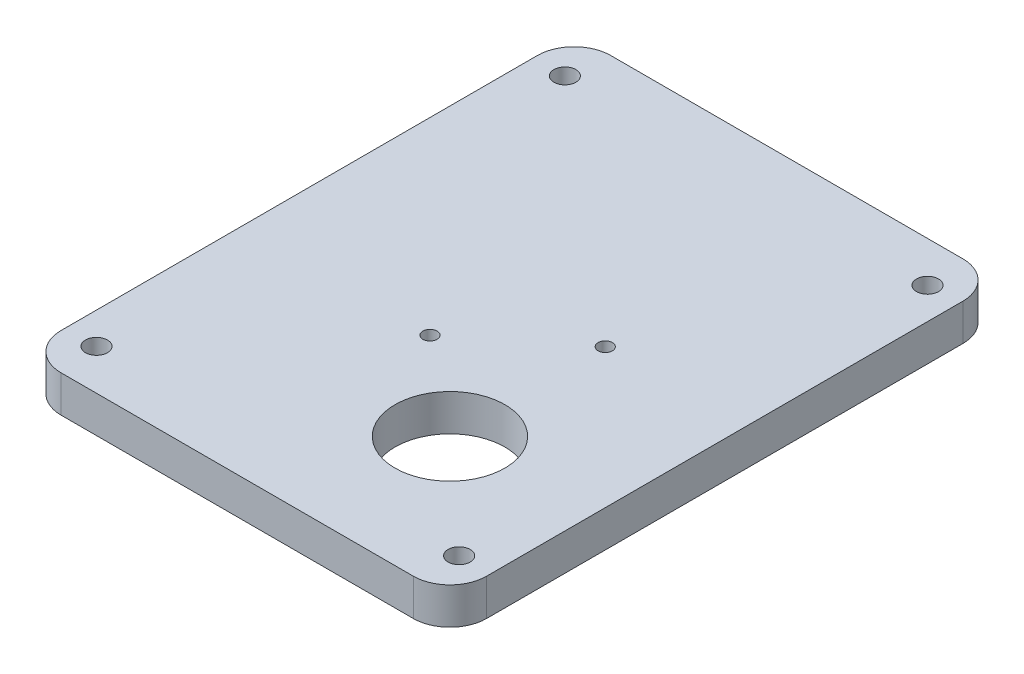
ISO-10303-21;
HEADER;
FILE_DESCRIPTION(('STEP AP214'),'2;1');
FILE_NAME('part.step','',(''),(''),'','','');
FILE_SCHEMA(('AUTOMOTIVE_DESIGN { 1 0 10303 214 1 1 1 1 }'));
ENDSEC;
DATA;
#1=APPLICATION_CONTEXT('core data for automotive mechanical design processes');
#2=APPLICATION_PROTOCOL_DEFINITION('international standard','automotive_design',2000,#1);
#3=PRODUCT_CONTEXT('',#1,'mechanical');
#4=PRODUCT('Part','Part','',(#3));
#5=PRODUCT_RELATED_PRODUCT_CATEGORY('part','',(#4));
#6=PRODUCT_DEFINITION_FORMATION('','',#4);
#7=PRODUCT_DEFINITION_CONTEXT('part definition',#1,'design');
#8=PRODUCT_DEFINITION('design','',#6,#7);
#9=PRODUCT_DEFINITION_SHAPE('','',#8);
#10=(LENGTH_UNIT() NAMED_UNIT(*) SI_UNIT(.MILLI.,.METRE.));
#11=(NAMED_UNIT(*) PLANE_ANGLE_UNIT() SI_UNIT($,.RADIAN.));
#12=(NAMED_UNIT(*) SI_UNIT($,.STERADIAN.) SOLID_ANGLE_UNIT());
#13=UNCERTAINTY_MEASURE_WITH_UNIT(LENGTH_MEASURE(1.E-05),#10,'distance_accuracy_value','');
#14=(GEOMETRIC_REPRESENTATION_CONTEXT(3) GLOBAL_UNCERTAINTY_ASSIGNED_CONTEXT((#13)) GLOBAL_UNIT_ASSIGNED_CONTEXT((#10,
#11,#12)) REPRESENTATION_CONTEXT('',''));
#15=CARTESIAN_POINT('',(0.,0.,0.));
#16=DIRECTION('',(0.,0.,1.));
#17=DIRECTION('',(1.,0.,0.));
#18=AXIS2_PLACEMENT_3D('',#15,#16,#17);
#19=CARTESIAN_POINT('',(0.,5.,0.));
#20=DIRECTION('',(0.,1.,0.));
#21=DIRECTION('',(0.,0.,1.));
#22=AXIS2_PLACEMENT_3D('',#19,#20,#21);
#23=PLANE('',#22);
#24=CARTESIAN_POINT('',(10.,5.,34.9132247305465));
#25=DIRECTION('',(0.,1.,0.));
#26=DIRECTION('',(0.,0.,1.));
#27=AXIS2_PLACEMENT_3D('',#24,#25,#26);
#28=CIRCLE('',#27,7.49);
#29=CARTESIAN_POINT('',(10.,5.,42.4032247305465));
#30=VERTEX_POINT('',#29);
#31=EDGE_CURVE('E258',#30,#30,#28,.T.);
#32=ORIENTED_EDGE('',*,*,#31,.F.);
#33=EDGE_LOOP('',(#32));
#34=FACE_BOUND('',#33,.T.);
#35=CARTESIAN_POINT('',(-24.7146645499354,5.,48.3782540819867));
#36=DIRECTION('',(0.,1.,0.));
#37=DIRECTION('',(0.,0.,1.));
#38=AXIS2_PLACEMENT_3D('',#35,#36,#37);
#39=CIRCLE('',#38,1.50000000000002);
#40=CARTESIAN_POINT('',(-24.7146645499354,5.,46.8782540819867));
#41=VERTEX_POINT('',#40);
#42=EDGE_CURVE('E240',#41,#41,#39,.F.);
#43=ORIENTED_EDGE('',*,*,#42,.T.);
#44=EDGE_LOOP('',(#43));
#45=FACE_BOUND('',#44,.T.);
#46=CARTESIAN_POINT('',(24.7146645499353,5.,-15.4650293514401));
#47=DIRECTION('',(0.,1.,0.));
#48=DIRECTION('',(0.,0.,1.));
#49=AXIS2_PLACEMENT_3D('',#46,#47,#48);
#50=CIRCLE('',#49,1.50000000000003);
#51=CARTESIAN_POINT('',(24.7146645499353,5.,-16.9650293514402));
#52=VERTEX_POINT('',#51);
#53=EDGE_CURVE('E243',#52,#52,#50,.F.);
#54=ORIENTED_EDGE('',*,*,#53,.T.);
#55=EDGE_LOOP('',(#54));
#56=FACE_BOUND('',#55,.T.);
#57=CARTESIAN_POINT('',(-3.30433866649104,5.,24.330475907707));
#58=DIRECTION('',(0.,1.,0.));
#59=DIRECTION('',(0.,0.,1.));
#60=AXIS2_PLACEMENT_3D('',#57,#58,#59);
#61=CIRCLE('',#60,0.975);
#62=CARTESIAN_POINT('',(-3.30433866649104,5.,25.305475907707));
#63=VERTEX_POINT('',#62);
#64=EDGE_CURVE('E140',#63,#63,#61,.T.);
#65=ORIENTED_EDGE('',*,*,#64,.F.);
#66=EDGE_LOOP('',(#65));
#67=FACE_BOUND('',#66,.T.);
#68=CARTESIAN_POINT('',(10.,5.,13.7477270848675));
#69=DIRECTION('',(0.,1.,0.));
#70=DIRECTION('',(0.,0.,1.));
#71=AXIS2_PLACEMENT_3D('',#68,#69,#70);
#72=CIRCLE('',#71,0.975);
#73=CARTESIAN_POINT('',(10.,5.,14.7227270848675));
#74=VERTEX_POINT('',#73);
#75=EDGE_CURVE('E229',#74,#74,#72,.T.);
#76=ORIENTED_EDGE('',*,*,#75,.F.);
#77=EDGE_LOOP('',(#76));
#78=FACE_BOUND('',#77,.T.);
#79=DIRECTION('',(0.,0.,-1.));
#80=VECTOR('',#79,1.);
#81=CARTESIAN_POINT('',(29.,5.,0.));
#82=LINE('',#81,#80);
#83=CARTESIAN_POINT('',(29.,5.,48.9132247305466));
#84=VERTEX_POINT('',#83);
#85=CARTESIAN_POINT('',(29.,5.,-16.));
#86=VERTEX_POINT('',#85);
#87=EDGE_CURVE('E228',#84,#86,#82,.T.);
#88=ORIENTED_EDGE('',*,*,#87,.T.);
#89=CARTESIAN_POINT('',(24.,5.,-16.));
#90=DIRECTION('',(0.,1.,0.));
#91=DIRECTION('',(0.,0.,1.));
#92=AXIS2_PLACEMENT_3D('',#89,#90,#91);
#93=CIRCLE('',#92,5.);
#94=CARTESIAN_POINT('',(24.,5.,-21.));
#95=VERTEX_POINT('',#94);
#96=EDGE_CURVE('E155',#86,#95,#93,.T.);
#97=ORIENTED_EDGE('',*,*,#96,.T.);
#98=DIRECTION('',(-1.,0.,0.));
#99=VECTOR('',#98,1.);
#100=CARTESIAN_POINT('',(0.,5.,-21.));
#101=LINE('',#100,#99);
#102=CARTESIAN_POINT('',(-24.,5.,-21.));
#103=VERTEX_POINT('',#102);
#104=EDGE_CURVE('E122',#95,#103,#101,.T.);
#105=ORIENTED_EDGE('',*,*,#104,.T.);
#106=CARTESIAN_POINT('',(-24.,5.,-16.));
#107=DIRECTION('',(0.,1.,0.));
#108=DIRECTION('',(0.,0.,1.));
#109=AXIS2_PLACEMENT_3D('',#106,#107,#108);
#110=CIRCLE('',#109,5.);
#111=CARTESIAN_POINT('',(-29.,5.,-16.));
#112=VERTEX_POINT('',#111);
#113=EDGE_CURVE('E150',#103,#112,#110,.T.);
#114=ORIENTED_EDGE('',*,*,#113,.T.);
#115=DIRECTION('',(0.,0.,1.));
#116=VECTOR('',#115,1.);
#117=CARTESIAN_POINT('',(-29.,5.,0.));
#118=LINE('',#117,#116);
#119=CARTESIAN_POINT('',(-29.,5.,48.9132247305466));
#120=VERTEX_POINT('',#119);
#121=EDGE_CURVE('E166',#112,#120,#118,.T.);
#122=ORIENTED_EDGE('',*,*,#121,.T.);
#123=CARTESIAN_POINT('',(-24.,5.,48.9132247305466));
#124=DIRECTION('',(0.,1.,0.));
#125=DIRECTION('',(0.,0.,1.));
#126=AXIS2_PLACEMENT_3D('',#123,#124,#125);
#127=CIRCLE('',#126,5.);
#128=CARTESIAN_POINT('',(-24.,5.,53.9132247305466));
#129=VERTEX_POINT('',#128);
#130=EDGE_CURVE('E58',#120,#129,#127,.T.);
#131=ORIENTED_EDGE('',*,*,#130,.T.);
#132=DIRECTION('',(1.,0.,0.));
#133=VECTOR('',#132,1.);
#134=CARTESIAN_POINT('',(0.,5.,53.9132247305466));
#135=LINE('',#134,#133);
#136=CARTESIAN_POINT('',(24.,5.,53.9132247305466));
#137=VERTEX_POINT('',#136);
#138=EDGE_CURVE('E141',#129,#137,#135,.T.);
#139=ORIENTED_EDGE('',*,*,#138,.T.);
#140=CARTESIAN_POINT('',(24.,5.,48.9132247305466));
#141=DIRECTION('',(0.,1.,0.));
#142=DIRECTION('',(0.,0.,1.));
#143=AXIS2_PLACEMENT_3D('',#140,#141,#142);
#144=CIRCLE('',#143,5.);
#145=EDGE_CURVE('E153',#137,#84,#144,.T.);
#146=ORIENTED_EDGE('',*,*,#145,.T.);
#147=EDGE_LOOP('',(#88,#97,#105,#114,#122,#131,#139,#146));
#148=FACE_BOUND('',#147,.T.);
#149=CARTESIAN_POINT('',(24.7146645499353,5.,48.3782540819867));
#150=DIRECTION('',(0.,1.,0.));
#151=DIRECTION('',(0.,0.,1.));
#152=AXIS2_PLACEMENT_3D('',#149,#150,#151);
#153=CIRCLE('',#152,1.50000000000002);
#154=CARTESIAN_POINT('',(24.7146645499353,5.,46.8782540819867));
#155=VERTEX_POINT('',#154);
#156=EDGE_CURVE('E237',#155,#155,#153,.T.);
#157=ORIENTED_EDGE('',*,*,#156,.F.);
#158=EDGE_LOOP('',(#157));
#159=FACE_BOUND('',#158,.T.);
#160=CARTESIAN_POINT('',(-24.7146645499354,5.,-15.4650293514401));
#161=DIRECTION('',(0.,1.,0.));
#162=DIRECTION('',(0.,0.,1.));
#163=AXIS2_PLACEMENT_3D('',#160,#161,#162);
#164=CIRCLE('',#163,1.50000000000002);
#165=CARTESIAN_POINT('',(-24.7146645499354,5.,-16.9650293514402));
#166=VERTEX_POINT('',#165);
#167=EDGE_CURVE('E181',#166,#166,#164,.T.);
#168=ORIENTED_EDGE('',*,*,#167,.F.);
#169=EDGE_LOOP('',(#168));
#170=FACE_BOUND('',#169,.T.);
#171=ADVANCED_FACE('F36',(#34,#45,#56,#67,#78,#148,#159,#170),#23,.T.);
#172=CARTESIAN_POINT('',(0.,0.,0.));
#173=DIRECTION('',(0.,1.,0.));
#174=DIRECTION('',(0.,0.,1.));
#175=AXIS2_PLACEMENT_3D('',#172,#173,#174);
#176=PLANE('',#175);
#177=CARTESIAN_POINT('',(10.,0.,34.9132247305465));
#178=DIRECTION('',(0.,1.,0.));
#179=DIRECTION('',(0.,0.,1.));
#180=AXIS2_PLACEMENT_3D('',#177,#178,#179);
#181=CIRCLE('',#180,7.49);
#182=CARTESIAN_POINT('',(10.,0.,42.4032247305465));
#183=VERTEX_POINT('',#182);
#184=EDGE_CURVE('E261',#183,#183,#181,.T.);
#185=ORIENTED_EDGE('',*,*,#184,.T.);
#186=EDGE_LOOP('',(#185));
#187=FACE_BOUND('',#186,.T.);
#188=CARTESIAN_POINT('',(24.7146645499353,0.,48.3782540819867));
#189=DIRECTION('',(0.,1.,0.));
#190=DIRECTION('',(0.,0.,1.));
#191=AXIS2_PLACEMENT_3D('',#188,#189,#190);
#192=CIRCLE('',#191,1.50000000000002);
#193=CARTESIAN_POINT('',(24.7146645499353,0.,46.8782540819867));
#194=VERTEX_POINT('',#193);
#195=EDGE_CURVE('E250',#194,#194,#192,.F.);
#196=ORIENTED_EDGE('',*,*,#195,.F.);
#197=EDGE_LOOP('',(#196));
#198=FACE_BOUND('',#197,.T.);
#199=CARTESIAN_POINT('',(-24.7146645499354,0.,48.3782540819867));
#200=DIRECTION('',(0.,1.,0.));
#201=DIRECTION('',(0.,0.,1.));
#202=AXIS2_PLACEMENT_3D('',#199,#200,#201);
#203=CIRCLE('',#202,1.50000000000002);
#204=CARTESIAN_POINT('',(-24.7146645499354,0.,46.8782540819867));
#205=VERTEX_POINT('',#204);
#206=EDGE_CURVE('E253',#205,#205,#203,.T.);
#207=ORIENTED_EDGE('',*,*,#206,.T.);
#208=EDGE_LOOP('',(#207));
#209=FACE_BOUND('',#208,.T.);
#210=CARTESIAN_POINT('',(24.7146645499353,0.,-15.4650293514401));
#211=DIRECTION('',(0.,1.,0.));
#212=DIRECTION('',(0.,0.,1.));
#213=AXIS2_PLACEMENT_3D('',#210,#211,#212);
#214=CIRCLE('',#213,1.50000000000003);
#215=CARTESIAN_POINT('',(24.7146645499353,0.,-16.9650293514402));
#216=VERTEX_POINT('',#215);
#217=EDGE_CURVE('E246',#216,#216,#214,.T.);
#218=ORIENTED_EDGE('',*,*,#217,.T.);
#219=EDGE_LOOP('',(#218));
#220=FACE_BOUND('',#219,.T.);
#221=CARTESIAN_POINT('',(-3.30433866649104,0.,24.330475907707));
#222=DIRECTION('',(0.,1.,0.));
#223=DIRECTION('',(0.,0.,1.));
#224=AXIS2_PLACEMENT_3D('',#221,#222,#223);
#225=CIRCLE('',#224,0.975);
#226=CARTESIAN_POINT('',(-3.30433866649104,0.,25.305475907707));
#227=VERTEX_POINT('',#226);
#228=EDGE_CURVE('E179',#227,#227,#225,.T.);
#229=ORIENTED_EDGE('',*,*,#228,.T.);
#230=EDGE_LOOP('',(#229));
#231=FACE_BOUND('',#230,.T.);
#232=CARTESIAN_POINT('',(10.,0.,13.7477270848675));
#233=DIRECTION('',(0.,1.,0.));
#234=DIRECTION('',(0.,0.,1.));
#235=AXIS2_PLACEMENT_3D('',#232,#233,#234);
#236=CIRCLE('',#235,0.975);
#237=CARTESIAN_POINT('',(10.,0.,14.7227270848675));
#238=VERTEX_POINT('',#237);
#239=EDGE_CURVE('E135',#238,#238,#236,.T.);
#240=ORIENTED_EDGE('',*,*,#239,.T.);
#241=EDGE_LOOP('',(#240));
#242=FACE_BOUND('',#241,.T.);
#243=DIRECTION('',(-1.,0.,0.));
#244=VECTOR('',#243,1.);
#245=CARTESIAN_POINT('',(0.,0.,-21.));
#246=LINE('',#245,#244);
#247=CARTESIAN_POINT('',(24.,0.,-21.));
#248=VERTEX_POINT('',#247);
#249=CARTESIAN_POINT('',(-24.,0.,-21.));
#250=VERTEX_POINT('',#249);
#251=EDGE_CURVE('E119',#248,#250,#246,.T.);
#252=ORIENTED_EDGE('',*,*,#251,.F.);
#253=CARTESIAN_POINT('',(24.,0.,-16.));
#254=DIRECTION('',(0.,1.,0.));
#255=DIRECTION('',(0.,0.,1.));
#256=AXIS2_PLACEMENT_3D('',#253,#254,#255);
#257=CIRCLE('',#256,5.);
#258=CARTESIAN_POINT('',(29.,0.,-16.));
#259=VERTEX_POINT('',#258);
#260=EDGE_CURVE('E102',#248,#259,#257,.F.);
#261=ORIENTED_EDGE('',*,*,#260,.T.);
#262=DIRECTION('',(0.,0.,-1.));
#263=VECTOR('',#262,1.);
#264=CARTESIAN_POINT('',(29.,0.,0.));
#265=LINE('',#264,#263);
#266=CARTESIAN_POINT('',(29.,0.,48.9132247305466));
#267=VERTEX_POINT('',#266);
#268=EDGE_CURVE('E130',#267,#259,#265,.T.);
#269=ORIENTED_EDGE('',*,*,#268,.F.);
#270=CARTESIAN_POINT('',(24.,0.,48.9132247305466));
#271=DIRECTION('',(0.,1.,0.));
#272=DIRECTION('',(0.,0.,1.));
#273=AXIS2_PLACEMENT_3D('',#270,#271,#272);
#274=CIRCLE('',#273,5.);
#275=CARTESIAN_POINT('',(24.,0.,53.9132247305466));
#276=VERTEX_POINT('',#275);
#277=EDGE_CURVE('E113',#267,#276,#274,.F.);
#278=ORIENTED_EDGE('',*,*,#277,.T.);
#279=DIRECTION('',(1.,0.,0.));
#280=VECTOR('',#279,1.);
#281=CARTESIAN_POINT('',(0.,0.,53.9132247305466));
#282=LINE('',#281,#280);
#283=CARTESIAN_POINT('',(-24.,0.,53.9132247305466));
#284=VERTEX_POINT('',#283);
#285=EDGE_CURVE('E133',#284,#276,#282,.T.);
#286=ORIENTED_EDGE('',*,*,#285,.F.);
#287=CARTESIAN_POINT('',(-24.,0.,48.9132247305466));
#288=DIRECTION('',(0.,1.,0.));
#289=DIRECTION('',(0.,0.,1.));
#290=AXIS2_PLACEMENT_3D('',#287,#288,#289);
#291=CIRCLE('',#290,5.);
#292=CARTESIAN_POINT('',(-29.,0.,48.9132247305466));
#293=VERTEX_POINT('',#292);
#294=EDGE_CURVE('E144',#284,#293,#291,.F.);
#295=ORIENTED_EDGE('',*,*,#294,.T.);
#296=DIRECTION('',(0.,0.,1.));
#297=VECTOR('',#296,1.);
#298=CARTESIAN_POINT('',(-29.,0.,0.));
#299=LINE('',#298,#297);
#300=CARTESIAN_POINT('',(-29.,0.,-16.));
#301=VERTEX_POINT('',#300);
#302=EDGE_CURVE('E129',#301,#293,#299,.T.);
#303=ORIENTED_EDGE('',*,*,#302,.F.);
#304=CARTESIAN_POINT('',(-24.,0.,-16.));
#305=DIRECTION('',(0.,1.,0.));
#306=DIRECTION('',(0.,0.,1.));
#307=AXIS2_PLACEMENT_3D('',#304,#305,#306);
#308=CIRCLE('',#307,5.);
#309=EDGE_CURVE('E123',#301,#250,#308,.F.);
#310=ORIENTED_EDGE('',*,*,#309,.T.);
#311=EDGE_LOOP('',(#252,#261,#269,#278,#286,#295,#303,#310));
#312=FACE_BOUND('',#311,.T.);
#313=CARTESIAN_POINT('',(-24.7146645499354,0.,-15.4650293514401));
#314=DIRECTION('',(0.,1.,0.));
#315=DIRECTION('',(0.,0.,1.));
#316=AXIS2_PLACEMENT_3D('',#313,#314,#315);
#317=CIRCLE('',#316,1.50000000000002);
#318=CARTESIAN_POINT('',(-24.7146645499354,0.,-16.9650293514402));
#319=VERTEX_POINT('',#318);
#320=EDGE_CURVE('E249',#319,#319,#317,.F.);
#321=ORIENTED_EDGE('',*,*,#320,.F.);
#322=EDGE_LOOP('',(#321));
#323=FACE_BOUND('',#322,.T.);
#324=ADVANCED_FACE('F126',(#187,#198,#209,#220,#231,#242,#312,#323),#176,.F.);
#325=CARTESIAN_POINT('',(29.,5.,0.));
#326=DIRECTION('',(-1.,0.,0.));
#327=DIRECTION('',(0.,0.,1.));
#328=AXIS2_PLACEMENT_3D('',#325,#326,#327);
#329=PLANE('',#328);
#330=ORIENTED_EDGE('',*,*,#268,.T.);
#331=DIRECTION('',(0.,-1.,0.));
#332=VECTOR('',#331,1.);
#333=CARTESIAN_POINT('',(29.,5.,-16.));
#334=LINE('',#333,#332);
#335=EDGE_CURVE('E107',#259,#86,#334,.F.);
#336=ORIENTED_EDGE('',*,*,#335,.T.);
#337=ORIENTED_EDGE('',*,*,#87,.F.);
#338=DIRECTION('',(0.,-1.,0.));
#339=VECTOR('',#338,1.);
#340=CARTESIAN_POINT('',(29.,5.,48.9132247305466));
#341=LINE('',#340,#339);
#342=EDGE_CURVE('E112',#84,#267,#341,.T.);
#343=ORIENTED_EDGE('',*,*,#342,.T.);
#344=EDGE_LOOP('',(#330,#336,#337,#343));
#345=FACE_BOUND('',#344,.T.);
#346=ADVANCED_FACE('F206',(#345),#329,.F.);
#347=CARTESIAN_POINT('',(0.,5.,-21.));
#348=DIRECTION('',(0.,0.,1.));
#349=DIRECTION('',(1.,0.,0.));
#350=AXIS2_PLACEMENT_3D('',#347,#348,#349);
#351=PLANE('',#350);
#352=ORIENTED_EDGE('',*,*,#104,.F.);
#353=DIRECTION('',(0.,-1.,0.));
#354=VECTOR('',#353,1.);
#355=CARTESIAN_POINT('',(24.,5.,-21.));
#356=LINE('',#355,#354);
#357=EDGE_CURVE('E106',#95,#248,#356,.T.);
#358=ORIENTED_EDGE('',*,*,#357,.T.);
#359=ORIENTED_EDGE('',*,*,#251,.T.);
#360=DIRECTION('',(0.,-1.,0.));
#361=VECTOR('',#360,1.);
#362=CARTESIAN_POINT('',(-24.,5.,-21.));
#363=LINE('',#362,#361);
#364=EDGE_CURVE('E124',#250,#103,#363,.F.);
#365=ORIENTED_EDGE('',*,*,#364,.T.);
#366=EDGE_LOOP('',(#352,#358,#359,#365));
#367=FACE_BOUND('',#366,.T.);
#368=ADVANCED_FACE('F118',(#367),#351,.F.);
#369=CARTESIAN_POINT('',(-29.,5.,0.));
#370=DIRECTION('',(1.,0.,0.));
#371=DIRECTION('',(0.,0.,-1.));
#372=AXIS2_PLACEMENT_3D('',#369,#370,#371);
#373=PLANE('',#372);
#374=ORIENTED_EDGE('',*,*,#302,.T.);
#375=DIRECTION('',(0.,-1.,0.));
#376=VECTOR('',#375,1.);
#377=CARTESIAN_POINT('',(-29.,5.,48.9132247305466));
#378=LINE('',#377,#376);
#379=EDGE_CURVE('E11',#293,#120,#378,.F.);
#380=ORIENTED_EDGE('',*,*,#379,.T.);
#381=ORIENTED_EDGE('',*,*,#121,.F.);
#382=DIRECTION('',(0.,-1.,0.));
#383=VECTOR('',#382,1.);
#384=CARTESIAN_POINT('',(-29.,5.,-16.));
#385=LINE('',#384,#383);
#386=EDGE_CURVE('E44',#112,#301,#385,.T.);
#387=ORIENTED_EDGE('',*,*,#386,.T.);
#388=EDGE_LOOP('',(#374,#380,#381,#387));
#389=FACE_BOUND('',#388,.T.);
#390=ADVANCED_FACE('F164',(#389),#373,.F.);
#391=CARTESIAN_POINT('',(10.,5.,13.7477270848675));
#392=DIRECTION('',(0.,-1.,0.));
#393=DIRECTION('',(0.,0.,-1.));
#394=AXIS2_PLACEMENT_3D('',#391,#392,#393);
#395=CYLINDRICAL_SURFACE('',#394,0.975);
#396=ORIENTED_EDGE('',*,*,#75,.T.);
#397=EDGE_LOOP('',(#396));
#398=FACE_BOUND('',#397,.T.);
#399=ORIENTED_EDGE('',*,*,#239,.F.);
#400=EDGE_LOOP('',(#399));
#401=FACE_BOUND('',#400,.T.);
#402=ADVANCED_FACE('F186',(#398,#401),#395,.F.);
#403=CARTESIAN_POINT('',(-3.30433866649104,5.,24.330475907707));
#404=DIRECTION('',(0.,-1.,0.));
#405=DIRECTION('',(0.,0.,-1.));
#406=AXIS2_PLACEMENT_3D('',#403,#404,#405);
#407=CYLINDRICAL_SURFACE('',#406,0.975);
#408=ORIENTED_EDGE('',*,*,#64,.T.);
#409=EDGE_LOOP('',(#408));
#410=FACE_BOUND('',#409,.T.);
#411=ORIENTED_EDGE('',*,*,#228,.F.);
#412=EDGE_LOOP('',(#411));
#413=FACE_BOUND('',#412,.T.);
#414=ADVANCED_FACE('F188',(#410,#413),#407,.F.);
#415=CARTESIAN_POINT('',(0.,5.,53.9132247305466));
#416=DIRECTION('',(0.,0.,-1.));
#417=DIRECTION('',(-1.,0.,0.));
#418=AXIS2_PLACEMENT_3D('',#415,#416,#417);
#419=PLANE('',#418);
#420=ORIENTED_EDGE('',*,*,#285,.T.);
#421=DIRECTION('',(0.,-1.,0.));
#422=VECTOR('',#421,1.);
#423=CARTESIAN_POINT('',(24.,5.,53.9132247305466));
#424=LINE('',#423,#422);
#425=EDGE_CURVE('E51',#276,#137,#424,.F.);
#426=ORIENTED_EDGE('',*,*,#425,.T.);
#427=ORIENTED_EDGE('',*,*,#138,.F.);
#428=DIRECTION('',(0.,-1.,0.));
#429=VECTOR('',#428,1.);
#430=CARTESIAN_POINT('',(-24.,5.,53.9132247305466));
#431=LINE('',#430,#429);
#432=EDGE_CURVE('E157',#129,#284,#431,.T.);
#433=ORIENTED_EDGE('',*,*,#432,.T.);
#434=EDGE_LOOP('',(#420,#426,#427,#433));
#435=FACE_BOUND('',#434,.T.);
#436=ADVANCED_FACE('F173',(#435),#419,.F.);
#437=CARTESIAN_POINT('',(24.,5.,-16.));
#438=DIRECTION('',(0.,-1.,0.));
#439=DIRECTION('',(0.,0.,-1.));
#440=AXIS2_PLACEMENT_3D('',#437,#438,#439);
#441=CYLINDRICAL_SURFACE('',#440,5.);
#442=ORIENTED_EDGE('',*,*,#96,.F.);
#443=ORIENTED_EDGE('',*,*,#335,.F.);
#444=ORIENTED_EDGE('',*,*,#260,.F.);
#445=ORIENTED_EDGE('',*,*,#357,.F.);
#446=EDGE_LOOP('',(#442,#443,#444,#445));
#447=FACE_BOUND('',#446,.T.);
#448=ADVANCED_FACE('F105',(#447),#441,.T.);
#449=CARTESIAN_POINT('',(24.,5.,48.9132247305466));
#450=DIRECTION('',(0.,-1.,0.));
#451=DIRECTION('',(0.,0.,-1.));
#452=AXIS2_PLACEMENT_3D('',#449,#450,#451);
#453=CYLINDRICAL_SURFACE('',#452,5.);
#454=ORIENTED_EDGE('',*,*,#145,.F.);
#455=ORIENTED_EDGE('',*,*,#425,.F.);
#456=ORIENTED_EDGE('',*,*,#277,.F.);
#457=ORIENTED_EDGE('',*,*,#342,.F.);
#458=EDGE_LOOP('',(#454,#455,#456,#457));
#459=FACE_BOUND('',#458,.T.);
#460=ADVANCED_FACE('F226',(#459),#453,.T.);
#461=CARTESIAN_POINT('',(-24.,5.,48.9132247305466));
#462=DIRECTION('',(0.,-1.,0.));
#463=DIRECTION('',(0.,0.,-1.));
#464=AXIS2_PLACEMENT_3D('',#461,#462,#463);
#465=CYLINDRICAL_SURFACE('',#464,5.);
#466=ORIENTED_EDGE('',*,*,#130,.F.);
#467=ORIENTED_EDGE('',*,*,#379,.F.);
#468=ORIENTED_EDGE('',*,*,#294,.F.);
#469=ORIENTED_EDGE('',*,*,#432,.F.);
#470=EDGE_LOOP('',(#466,#467,#468,#469));
#471=FACE_BOUND('',#470,.T.);
#472=ADVANCED_FACE('F172',(#471),#465,.T.);
#473=CARTESIAN_POINT('',(-24.,5.,-16.));
#474=DIRECTION('',(0.,-1.,0.));
#475=DIRECTION('',(0.,0.,-1.));
#476=AXIS2_PLACEMENT_3D('',#473,#474,#475);
#477=CYLINDRICAL_SURFACE('',#476,5.);
#478=ORIENTED_EDGE('',*,*,#113,.F.);
#479=ORIENTED_EDGE('',*,*,#364,.F.);
#480=ORIENTED_EDGE('',*,*,#309,.F.);
#481=ORIENTED_EDGE('',*,*,#386,.F.);
#482=EDGE_LOOP('',(#478,#479,#480,#481));
#483=FACE_BOUND('',#482,.T.);
#484=ADVANCED_FACE('F38',(#483),#477,.T.);
#485=CARTESIAN_POINT('',(24.7146645499353,14.,-15.4650293514401));
#486=DIRECTION('',(0.,-1.,0.));
#487=DIRECTION('',(0.,0.,-1.));
#488=AXIS2_PLACEMENT_3D('',#485,#486,#487);
#489=CYLINDRICAL_SURFACE('',#488,1.50000000000003);
#490=CARTESIAN_POINT('',(24.7146645499353,5.,-16.9650293514402));
#491=CARTESIAN_POINT('',(24.7146645499353,4.94791666666667,-16.9650293514402));
#492=CARTESIAN_POINT('',(24.7146645499353,4.89583333333333,-16.9650293514402));
#493=CARTESIAN_POINT('',(24.7146645499353,4.79166666666667,-16.9650293514402));
#494=CARTESIAN_POINT('',(24.7146645499353,4.73958333333333,-16.9650293514402));
#495=CARTESIAN_POINT('',(24.7146645499353,4.63541666666667,-16.9650293514402));
#496=CARTESIAN_POINT('',(24.7146645499353,4.58333333333333,-16.9650293514402));
#497=CARTESIAN_POINT('',(24.7146645499353,4.47916666666667,-16.9650293514402));
#498=CARTESIAN_POINT('',(24.7146645499353,4.42708333333333,-16.9650293514402));
#499=CARTESIAN_POINT('',(24.7146645499353,4.32291666666667,-16.9650293514402));
#500=CARTESIAN_POINT('',(24.7146645499353,4.27083333333333,-16.9650293514402));
#501=CARTESIAN_POINT('',(24.7146645499353,4.16666666666667,-16.9650293514402));
#502=CARTESIAN_POINT('',(24.7146645499353,4.11458333333333,-16.9650293514402));
#503=CARTESIAN_POINT('',(24.7146645499353,4.01041666666666,-16.9650293514402));
#504=CARTESIAN_POINT('',(24.7146645499353,3.95833333333333,-16.9650293514402));
#505=CARTESIAN_POINT('',(24.7146645499353,3.85416666666667,-16.9650293514402));
#506=CARTESIAN_POINT('',(24.7146645499353,3.80208333333333,-16.9650293514402));
#507=CARTESIAN_POINT('',(24.7146645499353,3.69791666666666,-16.9650293514402));
#508=CARTESIAN_POINT('',(24.7146645499353,3.64583333333333,-16.9650293514402));
#509=CARTESIAN_POINT('',(24.7146645499353,3.54166666666667,-16.9650293514402));
#510=CARTESIAN_POINT('',(24.7146645499353,3.48958333333333,-16.9650293514402));
#511=CARTESIAN_POINT('',(24.7146645499353,3.38541666666667,-16.9650293514402));
#512=CARTESIAN_POINT('',(24.7146645499353,3.33333333333333,-16.9650293514402));
#513=CARTESIAN_POINT('',(24.7146645499353,3.22916666666667,-16.9650293514402));
#514=CARTESIAN_POINT('',(24.7146645499353,3.17708333333333,-16.9650293514402));
#515=CARTESIAN_POINT('',(24.7146645499353,3.07291666666667,-16.9650293514402));
#516=CARTESIAN_POINT('',(24.7146645499353,3.02083333333333,-16.9650293514402));
#517=CARTESIAN_POINT('',(24.7146645499353,2.91666666666667,-16.9650293514402));
#518=CARTESIAN_POINT('',(24.7146645499353,2.86458333333333,-16.9650293514402));
#519=CARTESIAN_POINT('',(24.7146645499353,2.76041666666667,-16.9650293514402));
#520=CARTESIAN_POINT('',(24.7146645499353,2.70833333333333,-16.9650293514402));
#521=CARTESIAN_POINT('',(24.7146645499353,2.60416666666667,-16.9650293514402));
#522=CARTESIAN_POINT('',(24.7146645499353,2.55208333333333,-16.9650293514402));
#523=CARTESIAN_POINT('',(24.7146645499353,2.44791666666667,-16.9650293514402));
#524=CARTESIAN_POINT('',(24.7146645499353,2.39583333333333,-16.9650293514402));
#525=CARTESIAN_POINT('',(24.7146645499353,2.29166666666667,-16.9650293514402));
#526=CARTESIAN_POINT('',(24.7146645499353,2.23958333333333,-16.9650293514402));
#527=CARTESIAN_POINT('',(24.7146645499353,2.13541666666667,-16.9650293514402));
#528=CARTESIAN_POINT('',(24.7146645499353,2.08333333333333,-16.9650293514402));
#529=CARTESIAN_POINT('',(24.7146645499353,1.97916666666667,-16.9650293514402));
#530=CARTESIAN_POINT('',(24.7146645499353,1.92708333333333,-16.9650293514402));
#531=CARTESIAN_POINT('',(24.7146645499353,1.82291666666666,-16.9650293514402));
#532=CARTESIAN_POINT('',(24.7146645499353,1.77083333333333,-16.9650293514402));
#533=CARTESIAN_POINT('',(24.7146645499353,1.66666666666667,-16.9650293514402));
#534=CARTESIAN_POINT('',(24.7146645499353,1.61458333333333,-16.9650293514402));
#535=CARTESIAN_POINT('',(24.7146645499353,1.51041666666667,-16.9650293514402));
#536=CARTESIAN_POINT('',(24.7146645499353,1.45833333333333,-16.9650293514402));
#537=CARTESIAN_POINT('',(24.7146645499353,1.35416666666667,-16.9650293514402));
#538=CARTESIAN_POINT('',(24.7146645499353,1.30208333333333,-16.9650293514402));
#539=CARTESIAN_POINT('',(24.7146645499353,1.19791666666667,-16.9650293514402));
#540=CARTESIAN_POINT('',(24.7146645499353,1.14583333333333,-16.9650293514402));
#541=CARTESIAN_POINT('',(24.7146645499353,1.04166666666667,-16.9650293514402));
#542=CARTESIAN_POINT('',(24.7146645499353,0.989583333333333,-16.9650293514402));
#543=CARTESIAN_POINT('',(24.7146645499353,0.885416666666666,-16.9650293514402));
#544=CARTESIAN_POINT('',(24.7146645499353,0.833333333333332,-16.9650293514402));
#545=CARTESIAN_POINT('',(24.7146645499353,0.729166666666666,-16.9650293514402));
#546=CARTESIAN_POINT('',(24.7146645499353,0.677083333333332,-16.9650293514402));
#547=CARTESIAN_POINT('',(24.7146645499353,0.572916666666666,-16.9650293514402));
#548=CARTESIAN_POINT('',(24.7146645499353,0.520833333333332,-16.9650293514402));
#549=CARTESIAN_POINT('',(24.7146645499353,0.416666666666665,-16.9650293514402));
#550=CARTESIAN_POINT('',(24.7146645499353,0.364583333333332,-16.9650293514402));
#551=CARTESIAN_POINT('',(24.7146645499353,0.260416666666665,-16.9650293514402));
#552=CARTESIAN_POINT('',(24.7146645499353,0.208333333333332,-16.9650293514402));
#553=CARTESIAN_POINT('',(24.7146645499353,0.104166666666665,-16.9650293514402));
#554=CARTESIAN_POINT('',(24.7146645499353,0.0520833333333317,-16.9650293514402));
#555=CARTESIAN_POINT('',(24.7146645499353,0.,-16.9650293514402));
#556=B_SPLINE_CURVE_WITH_KNOTS('',3,(#490,#491,#492,#493,#494,#495,#496,#497,#498,#499,#500,
#501,#502,#503,#504,#505,#506,#507,#508,#509,#510,#511,#512,#513,#514,#515,#516,#517,#518,#519,
#520,#521,#522,#523,#524,#525,#526,#527,#528,#529,#530,#531,#532,#533,#534,#535,#536,#537,#538,
#539,#540,#541,#542,#543,#544,#545,#546,#547,#548,#549,#550,#551,#552,#553,#554,#555),
.UNSPECIFIED.,.F.,.F.,(4,2,2,2,2,2,2,2,2,2,2,2,2,2,2,2,2,2,2,2,2,2,2,2,2,2,2,2,2,2,2,2,4),(0.,
0.15625,0.3125,0.46875,0.625000000000001,0.781250000000001,0.937500000000001,1.09375,1.25,
1.40625,1.5625,1.71875,1.875,2.03125,2.1875,2.34375,2.5,2.65625,2.8125,2.96875,3.125,3.28125,
3.4375,3.59375,3.75,3.90625,4.0625,4.21875,4.375,4.53125,4.6875,4.84375,5.),.UNSPECIFIED.);
#557=EDGE_CURVE('BSEAM212',#52,#216,#556,.T.);
#558=ORIENTED_EDGE('',*,*,#53,.F.);
#559=ORIENTED_EDGE('',*,*,#217,.F.);
#560=ORIENTED_EDGE('',*,*,#557,.T.);
#561=ORIENTED_EDGE('',*,*,#557,.F.);
#562=EDGE_LOOP('',(#558,#560,#559,#561));
#563=FACE_BOUND('',#562,.T.);
#564=ADVANCED_FACE('F212',(#563),#489,.F.);
#565=CARTESIAN_POINT('',(-24.7146645499354,14.,48.3782540819867));
#566=DIRECTION('',(0.,-1.,0.));
#567=DIRECTION('',(0.,0.,-1.));
#568=AXIS2_PLACEMENT_3D('',#565,#566,#567);
#569=CYLINDRICAL_SURFACE('',#568,1.50000000000002);
#570=CARTESIAN_POINT('',(-24.7146645499354,5.,46.8782540819867));
#571=CARTESIAN_POINT('',(-24.7146645499354,4.94791666666667,46.8782540819867));
#572=CARTESIAN_POINT('',(-24.7146645499354,4.89583333333333,46.8782540819867));
#573=CARTESIAN_POINT('',(-24.7146645499354,4.79166666666667,46.8782540819867));
#574=CARTESIAN_POINT('',(-24.7146645499354,4.73958333333333,46.8782540819867));
#575=CARTESIAN_POINT('',(-24.7146645499354,4.63541666666667,46.8782540819867));
#576=CARTESIAN_POINT('',(-24.7146645499354,4.58333333333333,46.8782540819867));
#577=CARTESIAN_POINT('',(-24.7146645499354,4.47916666666667,46.8782540819867));
#578=CARTESIAN_POINT('',(-24.7146645499354,4.42708333333333,46.8782540819867));
#579=CARTESIAN_POINT('',(-24.7146645499354,4.32291666666667,46.8782540819867));
#580=CARTESIAN_POINT('',(-24.7146645499354,4.27083333333333,46.8782540819867));
#581=CARTESIAN_POINT('',(-24.7146645499354,4.16666666666667,46.8782540819867));
#582=CARTESIAN_POINT('',(-24.7146645499354,4.11458333333333,46.8782540819867));
#583=CARTESIAN_POINT('',(-24.7146645499354,4.01041666666666,46.8782540819867));
#584=CARTESIAN_POINT('',(-24.7146645499354,3.95833333333333,46.8782540819867));
#585=CARTESIAN_POINT('',(-24.7146645499354,3.85416666666667,46.8782540819867));
#586=CARTESIAN_POINT('',(-24.7146645499354,3.80208333333333,46.8782540819867));
#587=CARTESIAN_POINT('',(-24.7146645499354,3.69791666666666,46.8782540819867));
#588=CARTESIAN_POINT('',(-24.7146645499354,3.64583333333333,46.8782540819867));
#589=CARTESIAN_POINT('',(-24.7146645499354,3.54166666666667,46.8782540819867));
#590=CARTESIAN_POINT('',(-24.7146645499354,3.48958333333333,46.8782540819867));
#591=CARTESIAN_POINT('',(-24.7146645499354,3.38541666666667,46.8782540819867));
#592=CARTESIAN_POINT('',(-24.7146645499354,3.33333333333333,46.8782540819867));
#593=CARTESIAN_POINT('',(-24.7146645499354,3.22916666666667,46.8782540819867));
#594=CARTESIAN_POINT('',(-24.7146645499354,3.17708333333333,46.8782540819867));
#595=CARTESIAN_POINT('',(-24.7146645499354,3.07291666666667,46.8782540819867));
#596=CARTESIAN_POINT('',(-24.7146645499354,3.02083333333333,46.8782540819867));
#597=CARTESIAN_POINT('',(-24.7146645499354,2.91666666666667,46.8782540819867));
#598=CARTESIAN_POINT('',(-24.7146645499354,2.86458333333333,46.8782540819867));
#599=CARTESIAN_POINT('',(-24.7146645499354,2.76041666666667,46.8782540819867));
#600=CARTESIAN_POINT('',(-24.7146645499354,2.70833333333333,46.8782540819867));
#601=CARTESIAN_POINT('',(-24.7146645499354,2.60416666666667,46.8782540819867));
#602=CARTESIAN_POINT('',(-24.7146645499354,2.55208333333333,46.8782540819867));
#603=CARTESIAN_POINT('',(-24.7146645499354,2.44791666666667,46.8782540819867));
#604=CARTESIAN_POINT('',(-24.7146645499354,2.39583333333333,46.8782540819867));
#605=CARTESIAN_POINT('',(-24.7146645499354,2.29166666666667,46.8782540819867));
#606=CARTESIAN_POINT('',(-24.7146645499354,2.23958333333333,46.8782540819867));
#607=CARTESIAN_POINT('',(-24.7146645499354,2.13541666666667,46.8782540819867));
#608=CARTESIAN_POINT('',(-24.7146645499354,2.08333333333333,46.8782540819867));
#609=CARTESIAN_POINT('',(-24.7146645499354,1.97916666666667,46.8782540819867));
#610=CARTESIAN_POINT('',(-24.7146645499354,1.92708333333333,46.8782540819867));
#611=CARTESIAN_POINT('',(-24.7146645499354,1.82291666666666,46.8782540819867));
#612=CARTESIAN_POINT('',(-24.7146645499354,1.77083333333333,46.8782540819867));
#613=CARTESIAN_POINT('',(-24.7146645499354,1.66666666666667,46.8782540819867));
#614=CARTESIAN_POINT('',(-24.7146645499354,1.61458333333333,46.8782540819867));
#615=CARTESIAN_POINT('',(-24.7146645499354,1.51041666666667,46.8782540819867));
#616=CARTESIAN_POINT('',(-24.7146645499354,1.45833333333333,46.8782540819867));
#617=CARTESIAN_POINT('',(-24.7146645499354,1.35416666666667,46.8782540819867));
#618=CARTESIAN_POINT('',(-24.7146645499354,1.30208333333333,46.8782540819867));
#619=CARTESIAN_POINT('',(-24.7146645499354,1.19791666666667,46.8782540819867));
#620=CARTESIAN_POINT('',(-24.7146645499354,1.14583333333333,46.8782540819867));
#621=CARTESIAN_POINT('',(-24.7146645499354,1.04166666666667,46.8782540819867));
#622=CARTESIAN_POINT('',(-24.7146645499354,0.989583333333333,46.8782540819867));
#623=CARTESIAN_POINT('',(-24.7146645499354,0.885416666666666,46.8782540819867));
#624=CARTESIAN_POINT('',(-24.7146645499354,0.833333333333332,46.8782540819867));
#625=CARTESIAN_POINT('',(-24.7146645499354,0.729166666666666,46.8782540819867));
#626=CARTESIAN_POINT('',(-24.7146645499354,0.677083333333332,46.8782540819867));
#627=CARTESIAN_POINT('',(-24.7146645499354,0.572916666666666,46.8782540819867));
#628=CARTESIAN_POINT('',(-24.7146645499354,0.520833333333332,46.8782540819867));
#629=CARTESIAN_POINT('',(-24.7146645499354,0.416666666666665,46.8782540819867));
#630=CARTESIAN_POINT('',(-24.7146645499354,0.364583333333332,46.8782540819867));
#631=CARTESIAN_POINT('',(-24.7146645499354,0.260416666666665,46.8782540819867));
#632=CARTESIAN_POINT('',(-24.7146645499354,0.208333333333332,46.8782540819867));
#633=CARTESIAN_POINT('',(-24.7146645499354,0.104166666666665,46.8782540819867));
#634=CARTESIAN_POINT('',(-24.7146645499354,0.0520833333333317,46.8782540819867));
#635=CARTESIAN_POINT('',(-24.7146645499354,0.,46.8782540819867));
#636=B_SPLINE_CURVE_WITH_KNOTS('',3,(#570,#571,#572,#573,#574,#575,#576,#577,#578,#579,#580,
#581,#582,#583,#584,#585,#586,#587,#588,#589,#590,#591,#592,#593,#594,#595,#596,#597,#598,#599,
#600,#601,#602,#603,#604,#605,#606,#607,#608,#609,#610,#611,#612,#613,#614,#615,#616,#617,#618,
#619,#620,#621,#622,#623,#624,#625,#626,#627,#628,#629,#630,#631,#632,#633,#634,#635),
.UNSPECIFIED.,.F.,.F.,(4,2,2,2,2,2,2,2,2,2,2,2,2,2,2,2,2,2,2,2,2,2,2,2,2,2,2,2,2,2,2,2,4),(0.,
0.15625,0.3125,0.46875,0.625000000000001,0.781250000000001,0.937500000000001,1.09375,1.25,
1.40625,1.5625,1.71875,1.875,2.03125,2.1875,2.34375,2.5,2.65625,2.8125,2.96875,3.125,3.28125,
3.4375,3.59375,3.75,3.90625,4.0625,4.21875,4.375,4.53125,4.6875,4.84375,5.),.UNSPECIFIED.);
#637=EDGE_CURVE('BSEAM278',#41,#205,#636,.T.);
#638=ORIENTED_EDGE('',*,*,#42,.F.);
#639=ORIENTED_EDGE('',*,*,#206,.F.);
#640=ORIENTED_EDGE('',*,*,#637,.T.);
#641=ORIENTED_EDGE('',*,*,#637,.F.);
#642=EDGE_LOOP('',(#638,#640,#639,#641));
#643=FACE_BOUND('',#642,.T.);
#644=ADVANCED_FACE('F278',(#643),#569,.F.);
#645=CARTESIAN_POINT('',(24.7146645499353,14.,48.3782540819867));
#646=DIRECTION('',(0.,-1.,0.));
#647=DIRECTION('',(0.,0.,-1.));
#648=AXIS2_PLACEMENT_3D('',#645,#646,#647);
#649=CYLINDRICAL_SURFACE('',#648,1.50000000000002);
#650=CARTESIAN_POINT('',(24.7146645499353,5.,46.8782540819867));
#651=CARTESIAN_POINT('',(24.7146645499353,4.94791666666667,46.8782540819867));
#652=CARTESIAN_POINT('',(24.7146645499353,4.89583333333333,46.8782540819867));
#653=CARTESIAN_POINT('',(24.7146645499353,4.79166666666667,46.8782540819867));
#654=CARTESIAN_POINT('',(24.7146645499353,4.73958333333333,46.8782540819867));
#655=CARTESIAN_POINT('',(24.7146645499353,4.63541666666667,46.8782540819867));
#656=CARTESIAN_POINT('',(24.7146645499353,4.58333333333333,46.8782540819867));
#657=CARTESIAN_POINT('',(24.7146645499353,4.47916666666667,46.8782540819867));
#658=CARTESIAN_POINT('',(24.7146645499353,4.42708333333333,46.8782540819867));
#659=CARTESIAN_POINT('',(24.7146645499353,4.32291666666667,46.8782540819867));
#660=CARTESIAN_POINT('',(24.7146645499353,4.27083333333333,46.8782540819867));
#661=CARTESIAN_POINT('',(24.7146645499353,4.16666666666667,46.8782540819867));
#662=CARTESIAN_POINT('',(24.7146645499353,4.11458333333333,46.8782540819867));
#663=CARTESIAN_POINT('',(24.7146645499353,4.01041666666666,46.8782540819867));
#664=CARTESIAN_POINT('',(24.7146645499353,3.95833333333333,46.8782540819867));
#665=CARTESIAN_POINT('',(24.7146645499353,3.85416666666667,46.8782540819867));
#666=CARTESIAN_POINT('',(24.7146645499353,3.80208333333333,46.8782540819867));
#667=CARTESIAN_POINT('',(24.7146645499353,3.69791666666666,46.8782540819867));
#668=CARTESIAN_POINT('',(24.7146645499353,3.64583333333333,46.8782540819867));
#669=CARTESIAN_POINT('',(24.7146645499353,3.54166666666667,46.8782540819867));
#670=CARTESIAN_POINT('',(24.7146645499353,3.48958333333333,46.8782540819867));
#671=CARTESIAN_POINT('',(24.7146645499353,3.38541666666667,46.8782540819867));
#672=CARTESIAN_POINT('',(24.7146645499353,3.33333333333333,46.8782540819867));
#673=CARTESIAN_POINT('',(24.7146645499353,3.22916666666667,46.8782540819867));
#674=CARTESIAN_POINT('',(24.7146645499353,3.17708333333333,46.8782540819867));
#675=CARTESIAN_POINT('',(24.7146645499353,3.07291666666667,46.8782540819867));
#676=CARTESIAN_POINT('',(24.7146645499353,3.02083333333333,46.8782540819867));
#677=CARTESIAN_POINT('',(24.7146645499353,2.91666666666667,46.8782540819867));
#678=CARTESIAN_POINT('',(24.7146645499353,2.86458333333333,46.8782540819867));
#679=CARTESIAN_POINT('',(24.7146645499353,2.76041666666667,46.8782540819867));
#680=CARTESIAN_POINT('',(24.7146645499353,2.70833333333333,46.8782540819867));
#681=CARTESIAN_POINT('',(24.7146645499353,2.60416666666667,46.8782540819867));
#682=CARTESIAN_POINT('',(24.7146645499353,2.55208333333333,46.8782540819867));
#683=CARTESIAN_POINT('',(24.7146645499353,2.44791666666667,46.8782540819867));
#684=CARTESIAN_POINT('',(24.7146645499353,2.39583333333333,46.8782540819867));
#685=CARTESIAN_POINT('',(24.7146645499353,2.29166666666667,46.8782540819867));
#686=CARTESIAN_POINT('',(24.7146645499353,2.23958333333333,46.8782540819867));
#687=CARTESIAN_POINT('',(24.7146645499353,2.13541666666667,46.8782540819867));
#688=CARTESIAN_POINT('',(24.7146645499353,2.08333333333333,46.8782540819867));
#689=CARTESIAN_POINT('',(24.7146645499353,1.97916666666667,46.8782540819867));
#690=CARTESIAN_POINT('',(24.7146645499353,1.92708333333333,46.8782540819867));
#691=CARTESIAN_POINT('',(24.7146645499353,1.82291666666666,46.8782540819867));
#692=CARTESIAN_POINT('',(24.7146645499353,1.77083333333333,46.8782540819867));
#693=CARTESIAN_POINT('',(24.7146645499353,1.66666666666667,46.8782540819867));
#694=CARTESIAN_POINT('',(24.7146645499353,1.61458333333333,46.8782540819867));
#695=CARTESIAN_POINT('',(24.7146645499353,1.51041666666667,46.8782540819867));
#696=CARTESIAN_POINT('',(24.7146645499353,1.45833333333333,46.8782540819867));
#697=CARTESIAN_POINT('',(24.7146645499353,1.35416666666667,46.8782540819867));
#698=CARTESIAN_POINT('',(24.7146645499353,1.30208333333333,46.8782540819867));
#699=CARTESIAN_POINT('',(24.7146645499353,1.19791666666667,46.8782540819867));
#700=CARTESIAN_POINT('',(24.7146645499353,1.14583333333333,46.8782540819867));
#701=CARTESIAN_POINT('',(24.7146645499353,1.04166666666667,46.8782540819867));
#702=CARTESIAN_POINT('',(24.7146645499353,0.989583333333333,46.8782540819867));
#703=CARTESIAN_POINT('',(24.7146645499353,0.885416666666666,46.8782540819867));
#704=CARTESIAN_POINT('',(24.7146645499353,0.833333333333332,46.8782540819867));
#705=CARTESIAN_POINT('',(24.7146645499353,0.729166666666666,46.8782540819867));
#706=CARTESIAN_POINT('',(24.7146645499353,0.677083333333332,46.8782540819867));
#707=CARTESIAN_POINT('',(24.7146645499353,0.572916666666666,46.8782540819867));
#708=CARTESIAN_POINT('',(24.7146645499353,0.520833333333332,46.8782540819867));
#709=CARTESIAN_POINT('',(24.7146645499353,0.416666666666665,46.8782540819867));
#710=CARTESIAN_POINT('',(24.7146645499353,0.364583333333332,46.8782540819867));
#711=CARTESIAN_POINT('',(24.7146645499353,0.260416666666665,46.8782540819867));
#712=CARTESIAN_POINT('',(24.7146645499353,0.208333333333332,46.8782540819867));
#713=CARTESIAN_POINT('',(24.7146645499353,0.104166666666665,46.8782540819867));
#714=CARTESIAN_POINT('',(24.7146645499353,0.0520833333333317,46.8782540819867));
#715=CARTESIAN_POINT('',(24.7146645499353,0.,46.8782540819867));
#716=B_SPLINE_CURVE_WITH_KNOTS('',3,(#650,#651,#652,#653,#654,#655,#656,#657,#658,#659,#660,
#661,#662,#663,#664,#665,#666,#667,#668,#669,#670,#671,#672,#673,#674,#675,#676,#677,#678,#679,
#680,#681,#682,#683,#684,#685,#686,#687,#688,#689,#690,#691,#692,#693,#694,#695,#696,#697,#698,
#699,#700,#701,#702,#703,#704,#705,#706,#707,#708,#709,#710,#711,#712,#713,#714,#715),
.UNSPECIFIED.,.F.,.F.,(4,2,2,2,2,2,2,2,2,2,2,2,2,2,2,2,2,2,2,2,2,2,2,2,2,2,2,2,2,2,2,2,4),(0.,
0.15625,0.3125,0.46875,0.625000000000001,0.781250000000001,0.937500000000001,1.09375,1.25,
1.40625,1.5625,1.71875,1.875,2.03125,2.1875,2.34375,2.5,2.65625,2.8125,2.96875,3.125,3.28125,
3.4375,3.59375,3.75,3.90625,4.0625,4.21875,4.375,4.53125,4.6875,4.84375,5.),.UNSPECIFIED.);
#717=EDGE_CURVE('BSEAM274',#155,#194,#716,.T.);
#718=ORIENTED_EDGE('',*,*,#156,.T.);
#719=ORIENTED_EDGE('',*,*,#195,.T.);
#720=ORIENTED_EDGE('',*,*,#717,.T.);
#721=ORIENTED_EDGE('',*,*,#717,.F.);
#722=EDGE_LOOP('',(#718,#720,#719,#721));
#723=FACE_BOUND('',#722,.T.);
#724=ADVANCED_FACE('F274',(#723),#649,.F.);
#725=CARTESIAN_POINT('',(-24.7146645499354,14.,-15.4650293514401));
#726=DIRECTION('',(0.,-1.,0.));
#727=DIRECTION('',(0.,0.,-1.));
#728=AXIS2_PLACEMENT_3D('',#725,#726,#727);
#729=CYLINDRICAL_SURFACE('',#728,1.50000000000002);
#730=CARTESIAN_POINT('',(-24.7146645499354,5.,-16.9650293514402));
#731=CARTESIAN_POINT('',(-24.7146645499354,4.94791666666667,-16.9650293514402));
#732=CARTESIAN_POINT('',(-24.7146645499354,4.89583333333333,-16.9650293514402));
#733=CARTESIAN_POINT('',(-24.7146645499354,4.79166666666667,-16.9650293514402));
#734=CARTESIAN_POINT('',(-24.7146645499354,4.73958333333333,-16.9650293514402));
#735=CARTESIAN_POINT('',(-24.7146645499354,4.63541666666667,-16.9650293514402));
#736=CARTESIAN_POINT('',(-24.7146645499354,4.58333333333333,-16.9650293514402));
#737=CARTESIAN_POINT('',(-24.7146645499354,4.47916666666667,-16.9650293514402));
#738=CARTESIAN_POINT('',(-24.7146645499354,4.42708333333333,-16.9650293514402));
#739=CARTESIAN_POINT('',(-24.7146645499354,4.32291666666667,-16.9650293514402));
#740=CARTESIAN_POINT('',(-24.7146645499354,4.27083333333333,-16.9650293514402));
#741=CARTESIAN_POINT('',(-24.7146645499354,4.16666666666667,-16.9650293514402));
#742=CARTESIAN_POINT('',(-24.7146645499354,4.11458333333333,-16.9650293514402));
#743=CARTESIAN_POINT('',(-24.7146645499354,4.01041666666666,-16.9650293514402));
#744=CARTESIAN_POINT('',(-24.7146645499354,3.95833333333333,-16.9650293514402));
#745=CARTESIAN_POINT('',(-24.7146645499354,3.85416666666667,-16.9650293514402));
#746=CARTESIAN_POINT('',(-24.7146645499354,3.80208333333333,-16.9650293514402));
#747=CARTESIAN_POINT('',(-24.7146645499354,3.69791666666666,-16.9650293514402));
#748=CARTESIAN_POINT('',(-24.7146645499354,3.64583333333333,-16.9650293514402));
#749=CARTESIAN_POINT('',(-24.7146645499354,3.54166666666667,-16.9650293514402));
#750=CARTESIAN_POINT('',(-24.7146645499354,3.48958333333333,-16.9650293514402));
#751=CARTESIAN_POINT('',(-24.7146645499354,3.38541666666667,-16.9650293514402));
#752=CARTESIAN_POINT('',(-24.7146645499354,3.33333333333333,-16.9650293514402));
#753=CARTESIAN_POINT('',(-24.7146645499354,3.22916666666667,-16.9650293514402));
#754=CARTESIAN_POINT('',(-24.7146645499354,3.17708333333333,-16.9650293514402));
#755=CARTESIAN_POINT('',(-24.7146645499354,3.07291666666667,-16.9650293514402));
#756=CARTESIAN_POINT('',(-24.7146645499354,3.02083333333333,-16.9650293514402));
#757=CARTESIAN_POINT('',(-24.7146645499354,2.91666666666667,-16.9650293514402));
#758=CARTESIAN_POINT('',(-24.7146645499354,2.86458333333333,-16.9650293514402));
#759=CARTESIAN_POINT('',(-24.7146645499354,2.76041666666667,-16.9650293514402));
#760=CARTESIAN_POINT('',(-24.7146645499354,2.70833333333333,-16.9650293514402));
#761=CARTESIAN_POINT('',(-24.7146645499354,2.60416666666667,-16.9650293514402));
#762=CARTESIAN_POINT('',(-24.7146645499354,2.55208333333333,-16.9650293514402));
#763=CARTESIAN_POINT('',(-24.7146645499354,2.44791666666667,-16.9650293514402));
#764=CARTESIAN_POINT('',(-24.7146645499354,2.39583333333333,-16.9650293514402));
#765=CARTESIAN_POINT('',(-24.7146645499354,2.29166666666667,-16.9650293514402));
#766=CARTESIAN_POINT('',(-24.7146645499354,2.23958333333333,-16.9650293514402));
#767=CARTESIAN_POINT('',(-24.7146645499354,2.13541666666667,-16.9650293514402));
#768=CARTESIAN_POINT('',(-24.7146645499354,2.08333333333333,-16.9650293514402));
#769=CARTESIAN_POINT('',(-24.7146645499354,1.97916666666667,-16.9650293514402));
#770=CARTESIAN_POINT('',(-24.7146645499354,1.92708333333333,-16.9650293514402));
#771=CARTESIAN_POINT('',(-24.7146645499354,1.82291666666666,-16.9650293514402));
#772=CARTESIAN_POINT('',(-24.7146645499354,1.77083333333333,-16.9650293514402));
#773=CARTESIAN_POINT('',(-24.7146645499354,1.66666666666667,-16.9650293514402));
#774=CARTESIAN_POINT('',(-24.7146645499354,1.61458333333333,-16.9650293514402));
#775=CARTESIAN_POINT('',(-24.7146645499354,1.51041666666667,-16.9650293514402));
#776=CARTESIAN_POINT('',(-24.7146645499354,1.45833333333333,-16.9650293514402));
#777=CARTESIAN_POINT('',(-24.7146645499354,1.35416666666667,-16.9650293514402));
#778=CARTESIAN_POINT('',(-24.7146645499354,1.30208333333333,-16.9650293514402));
#779=CARTESIAN_POINT('',(-24.7146645499354,1.19791666666667,-16.9650293514402));
#780=CARTESIAN_POINT('',(-24.7146645499354,1.14583333333333,-16.9650293514402));
#781=CARTESIAN_POINT('',(-24.7146645499354,1.04166666666667,-16.9650293514402));
#782=CARTESIAN_POINT('',(-24.7146645499354,0.989583333333333,-16.9650293514402));
#783=CARTESIAN_POINT('',(-24.7146645499354,0.885416666666666,-16.9650293514402));
#784=CARTESIAN_POINT('',(-24.7146645499354,0.833333333333332,-16.9650293514402));
#785=CARTESIAN_POINT('',(-24.7146645499354,0.729166666666666,-16.9650293514402));
#786=CARTESIAN_POINT('',(-24.7146645499354,0.677083333333332,-16.9650293514402));
#787=CARTESIAN_POINT('',(-24.7146645499354,0.572916666666666,-16.9650293514402));
#788=CARTESIAN_POINT('',(-24.7146645499354,0.520833333333332,-16.9650293514402));
#789=CARTESIAN_POINT('',(-24.7146645499354,0.416666666666665,-16.9650293514402));
#790=CARTESIAN_POINT('',(-24.7146645499354,0.364583333333332,-16.9650293514402));
#791=CARTESIAN_POINT('',(-24.7146645499354,0.260416666666665,-16.9650293514402));
#792=CARTESIAN_POINT('',(-24.7146645499354,0.208333333333332,-16.9650293514402));
#793=CARTESIAN_POINT('',(-24.7146645499354,0.104166666666665,-16.9650293514402));
#794=CARTESIAN_POINT('',(-24.7146645499354,0.0520833333333317,-16.9650293514402));
#795=CARTESIAN_POINT('',(-24.7146645499354,0.,-16.9650293514402));
#796=B_SPLINE_CURVE_WITH_KNOTS('',3,(#730,#731,#732,#733,#734,#735,#736,#737,#738,#739,#740,
#741,#742,#743,#744,#745,#746,#747,#748,#749,#750,#751,#752,#753,#754,#755,#756,#757,#758,#759,
#760,#761,#762,#763,#764,#765,#766,#767,#768,#769,#770,#771,#772,#773,#774,#775,#776,#777,#778,
#779,#780,#781,#782,#783,#784,#785,#786,#787,#788,#789,#790,#791,#792,#793,#794,#795),
.UNSPECIFIED.,.F.,.F.,(4,2,2,2,2,2,2,2,2,2,2,2,2,2,2,2,2,2,2,2,2,2,2,2,2,2,2,2,2,2,2,2,4),(0.,
0.15625,0.3125,0.46875,0.625000000000001,0.781250000000001,0.937500000000001,1.09375,1.25,
1.40625,1.5625,1.71875,1.875,2.03125,2.1875,2.34375,2.5,2.65625,2.8125,2.96875,3.125,3.28125,
3.4375,3.59375,3.75,3.90625,4.0625,4.21875,4.375,4.53125,4.6875,4.84375,5.),.UNSPECIFIED.);
#797=EDGE_CURVE('BSEAM269',#166,#319,#796,.T.);
#798=ORIENTED_EDGE('',*,*,#167,.T.);
#799=ORIENTED_EDGE('',*,*,#320,.T.);
#800=ORIENTED_EDGE('',*,*,#797,.T.);
#801=ORIENTED_EDGE('',*,*,#797,.F.);
#802=EDGE_LOOP('',(#798,#800,#799,#801));
#803=FACE_BOUND('',#802,.T.);
#804=ADVANCED_FACE('F269',(#803),#729,.F.);
#805=CARTESIAN_POINT('',(10.,26.184919164349,34.9132247305465));
#806=DIRECTION('',(0.,-1.,0.));
#807=DIRECTION('',(0.,0.,-1.));
#808=AXIS2_PLACEMENT_3D('',#805,#806,#807);
#809=CYLINDRICAL_SURFACE('',#808,7.49);
#810=ORIENTED_EDGE('',*,*,#184,.F.);
#811=EDGE_LOOP('',(#810));
#812=FACE_BOUND('',#811,.T.);
#813=ORIENTED_EDGE('',*,*,#31,.T.);
#814=EDGE_LOOP('',(#813));
#815=FACE_BOUND('',#814,.T.);
#816=ADVANCED_FACE('F266',(#812,#815),#809,.F.);
#817=CLOSED_SHELL('',(#171,#324,#346,#368,#390,#402,#414,#436,#448,#460,#472,#484,#564,#644,
#724,#804,#816));
#818=MANIFOLD_SOLID_BREP('B2',#817);
#819=ADVANCED_BREP_SHAPE_REPRESENTATION('',(#18,#818),#14);
#820=SHAPE_DEFINITION_REPRESENTATION(#9,#819);
ENDSEC;
END-ISO-10303-21;
